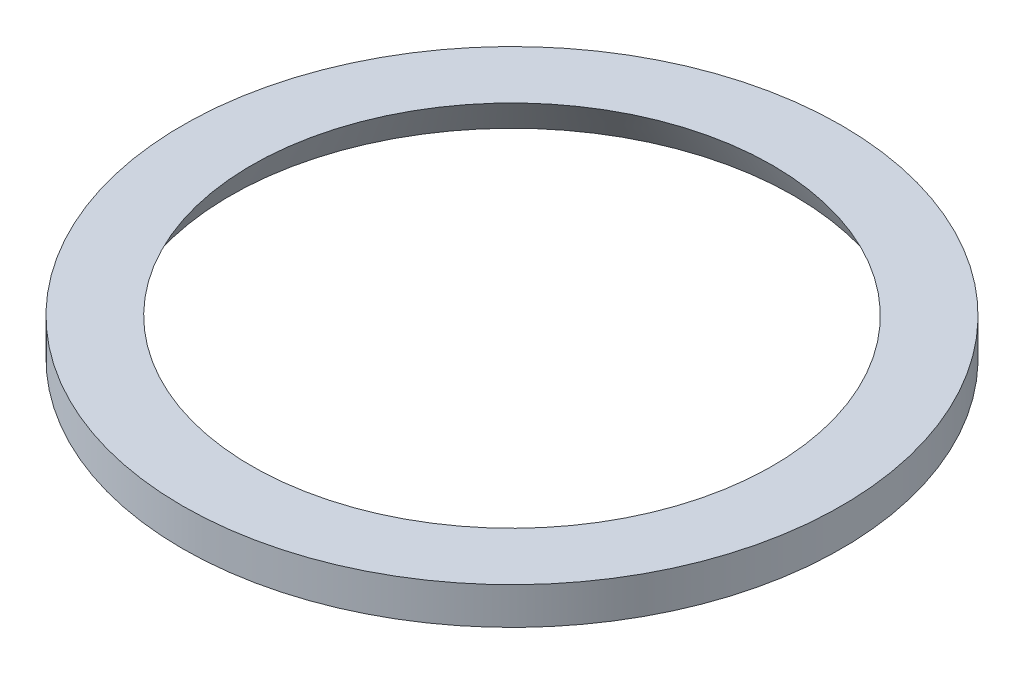
ISO-10303-21;
HEADER;
FILE_DESCRIPTION(('STEP AP214'),'2;1');
FILE_NAME('part.step','',(''),(''),'','','');
FILE_SCHEMA(('AUTOMOTIVE_DESIGN { 1 0 10303 214 1 1 1 1 }'));
ENDSEC;
DATA;
#1=APPLICATION_CONTEXT('core data for automotive mechanical design processes');
#2=APPLICATION_PROTOCOL_DEFINITION('international standard','automotive_design',2000,#1);
#3=PRODUCT_CONTEXT('',#1,'mechanical');
#4=PRODUCT('Part','Part','',(#3));
#5=PRODUCT_RELATED_PRODUCT_CATEGORY('part','',(#4));
#6=PRODUCT_DEFINITION_FORMATION('','',#4);
#7=PRODUCT_DEFINITION_CONTEXT('part definition',#1,'design');
#8=PRODUCT_DEFINITION('design','',#6,#7);
#9=PRODUCT_DEFINITION_SHAPE('','',#8);
#10=(LENGTH_UNIT() NAMED_UNIT(*) SI_UNIT(.MILLI.,.METRE.));
#11=(NAMED_UNIT(*) PLANE_ANGLE_UNIT() SI_UNIT($,.RADIAN.));
#12=(NAMED_UNIT(*) SI_UNIT($,.STERADIAN.) SOLID_ANGLE_UNIT());
#13=UNCERTAINTY_MEASURE_WITH_UNIT(LENGTH_MEASURE(1.E-05),#10,'distance_accuracy_value','');
#14=(GEOMETRIC_REPRESENTATION_CONTEXT(3) GLOBAL_UNCERTAINTY_ASSIGNED_CONTEXT((#13)) GLOBAL_UNIT_ASSIGNED_CONTEXT((#10,
#11,#12)) REPRESENTATION_CONTEXT('',''));
#15=CARTESIAN_POINT('',(0.,0.,0.));
#16=DIRECTION('',(0.,0.,1.));
#17=DIRECTION('',(1.,0.,0.));
#18=AXIS2_PLACEMENT_3D('',#15,#16,#17);
#19=CARTESIAN_POINT('',(-89.,0.,0.));
#20=DIRECTION('',(0.,1.,0.));
#21=DIRECTION('',(0.,0.,1.));
#22=AXIS2_PLACEMENT_3D('',#19,#20,#21);
#23=PLANE('',#22);
#24=CARTESIAN_POINT('',(0.,0.,0.));
#25=DIRECTION('',(0.,-1.,0.));
#26=DIRECTION('',(0.,0.,-1.));
#27=AXIS2_PLACEMENT_3D('',#24,#25,#26);
#28=CIRCLE('',#27,76.1132486540518);
#29=CARTESIAN_POINT('',(0.,0.,-76.1132486540518));
#30=VERTEX_POINT('',#29);
#31=EDGE_CURVE('E10',#30,#30,#28,.T.);
#32=ORIENTED_EDGE('',*,*,#31,.F.);
#33=EDGE_LOOP('',(#32));
#34=FACE_BOUND('',#33,.T.);
#35=CARTESIAN_POINT('',(0.,0.,0.));
#36=DIRECTION('',(0.,-1.,0.));
#37=DIRECTION('',(0.,0.,-1.));
#38=AXIS2_PLACEMENT_3D('',#35,#36,#37);
#39=CIRCLE('',#38,89.);
#40=CARTESIAN_POINT('',(0.,0.,-89.));
#41=VERTEX_POINT('',#40);
#42=EDGE_CURVE('E58',#41,#41,#39,.T.);
#43=ORIENTED_EDGE('',*,*,#42,.T.);
#44=EDGE_LOOP('',(#43));
#45=FACE_BOUND('',#44,.T.);
#46=ADVANCED_FACE('F41',(#34,#45),#23,.F.);
#47=CARTESIAN_POINT('',(0.,0.,0.));
#48=DIRECTION('',(0.,-1.,0.));
#49=DIRECTION('',(0.,0.,-1.));
#50=AXIS2_PLACEMENT_3D('',#47,#48,#49);
#51=CONICAL_SURFACE('',#50,76.1132486540518,0.523598775598303);
#52=CARTESIAN_POINT('',(0.,9.99999999999999,0.));
#53=DIRECTION('',(0.,-1.,0.));
#54=DIRECTION('',(0.,0.,-1.));
#55=AXIS2_PLACEMENT_3D('',#52,#53,#54);
#56=CIRCLE('',#55,70.3397459621555);
#57=CARTESIAN_POINT('',(0.,9.99999999999999,-70.3397459621555));
#58=VERTEX_POINT('',#57);
#59=EDGE_CURVE('E48',#58,#58,#56,.T.);
#60=ORIENTED_EDGE('',*,*,#59,.F.);
#61=EDGE_LOOP('',(#60));
#62=FACE_BOUND('',#61,.T.);
#63=ORIENTED_EDGE('',*,*,#31,.T.);
#64=EDGE_LOOP('',(#63));
#65=FACE_BOUND('',#64,.T.);
#66=ADVANCED_FACE('F74',(#62,#65),#51,.F.);
#67=CARTESIAN_POINT('',(-89.,9.99999999999999,0.));
#68=DIRECTION('',(0.,-1.,0.));
#69=DIRECTION('',(0.,0.,-1.));
#70=AXIS2_PLACEMENT_3D('',#67,#68,#69);
#71=PLANE('',#70);
#72=CARTESIAN_POINT('',(0.,9.99999999999999,0.));
#73=DIRECTION('',(0.,-1.,0.));
#74=DIRECTION('',(0.,0.,-1.));
#75=AXIS2_PLACEMENT_3D('',#72,#73,#74);
#76=CIRCLE('',#75,89.);
#77=CARTESIAN_POINT('',(0.,9.99999999999999,-89.));
#78=VERTEX_POINT('',#77);
#79=EDGE_CURVE('E53',#78,#78,#76,.T.);
#80=ORIENTED_EDGE('',*,*,#79,.F.);
#81=EDGE_LOOP('',(#80));
#82=FACE_BOUND('',#81,.T.);
#83=ORIENTED_EDGE('',*,*,#59,.T.);
#84=EDGE_LOOP('',(#83));
#85=FACE_BOUND('',#84,.T.);
#86=ADVANCED_FACE('F69',(#82,#85),#71,.F.);
#87=CARTESIAN_POINT('',(0.,0.,0.));
#88=DIRECTION('',(0.,-1.,0.));
#89=DIRECTION('',(0.,0.,-1.));
#90=AXIS2_PLACEMENT_3D('',#87,#88,#89);
#91=CYLINDRICAL_SURFACE('',#90,89.);
#92=ORIENTED_EDGE('',*,*,#42,.F.);
#93=EDGE_LOOP('',(#92));
#94=FACE_BOUND('',#93,.T.);
#95=ORIENTED_EDGE('',*,*,#79,.T.);
#96=EDGE_LOOP('',(#95));
#97=FACE_BOUND('',#96,.T.);
#98=ADVANCED_FACE('F66',(#94,#97),#91,.T.);
#99=CLOSED_SHELL('',(#46,#66,#86,#98));
#100=MANIFOLD_SOLID_BREP('B2',#99);
#101=ADVANCED_BREP_SHAPE_REPRESENTATION('',(#18,#100),#14);
#102=SHAPE_DEFINITION_REPRESENTATION(#9,#101);
ENDSEC;
END-ISO-10303-21;
